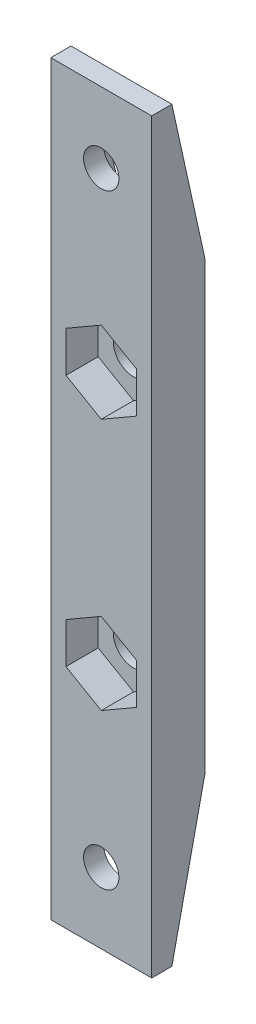
ISO-10303-21;
HEADER;
FILE_DESCRIPTION(('STEP AP214'),'2;1');
FILE_NAME('part.step','',(''),(''),'','','');
FILE_SCHEMA(('AUTOMOTIVE_DESIGN { 1 0 10303 214 1 1 1 1 }'));
ENDSEC;
DATA;
#1=APPLICATION_CONTEXT('core data for automotive mechanical design processes');
#2=APPLICATION_PROTOCOL_DEFINITION('international standard','automotive_design',2000,#1);
#3=PRODUCT_CONTEXT('',#1,'mechanical');
#4=PRODUCT('Part','Part','',(#3));
#5=PRODUCT_RELATED_PRODUCT_CATEGORY('part','',(#4));
#6=PRODUCT_DEFINITION_FORMATION('','',#4);
#7=PRODUCT_DEFINITION_CONTEXT('part definition',#1,'design');
#8=PRODUCT_DEFINITION('design','',#6,#7);
#9=PRODUCT_DEFINITION_SHAPE('','',#8);
#10=(LENGTH_UNIT() NAMED_UNIT(*) SI_UNIT(.MILLI.,.METRE.));
#11=(NAMED_UNIT(*) PLANE_ANGLE_UNIT() SI_UNIT($,.RADIAN.));
#12=(NAMED_UNIT(*) SI_UNIT($,.STERADIAN.) SOLID_ANGLE_UNIT());
#13=UNCERTAINTY_MEASURE_WITH_UNIT(LENGTH_MEASURE(1.E-05),#10,'distance_accuracy_value','');
#14=(GEOMETRIC_REPRESENTATION_CONTEXT(3) GLOBAL_UNCERTAINTY_ASSIGNED_CONTEXT((#13)) GLOBAL_UNIT_ASSIGNED_CONTEXT((#10,
#11,#12)) REPRESENTATION_CONTEXT('',''));
#15=CARTESIAN_POINT('',(0.,0.,0.));
#16=DIRECTION('',(0.,0.,1.));
#17=DIRECTION('',(1.,0.,0.));
#18=AXIS2_PLACEMENT_3D('',#15,#16,#17);
#19=CARTESIAN_POINT('',(0.,0.,5.3));
#20=DIRECTION('',(1.,0.,0.));
#21=DIRECTION('',(0.,1.,0.));
#22=AXIS2_PLACEMENT_3D('',#19,#20,#21);
#23=PLANE('',#22);
#24=DIRECTION('',(0.,-1.,0.));
#25=VECTOR('',#24,1.);
#26=CARTESIAN_POINT('',(0.,0.,0.));
#27=LINE('',#26,#25);
#28=CARTESIAN_POINT('',(0.,47.,0.));
#29=VERTEX_POINT('',#28);
#30=CARTESIAN_POINT('',(0.,3.,0.));
#31=VERTEX_POINT('',#30);
#32=EDGE_CURVE('E366',#29,#31,#27,.T.);
#33=ORIENTED_EDGE('',*,*,#32,.T.);
#34=DIRECTION('',(0.,0.97664446670509,-0.21486178267512));
#35=VECTOR('',#34,1.);
#36=CARTESIAN_POINT('',(0.,-12.,3.3));
#37=LINE('',#36,#35);
#38=CARTESIAN_POINT('',(0.,-12.,3.3));
#39=VERTEX_POINT('',#38);
#40=EDGE_CURVE('E234',#39,#31,#37,.T.);
#41=ORIENTED_EDGE('',*,*,#40,.F.);
#42=DIRECTION('',(0.,0.,-1.));
#43=VECTOR('',#42,1.);
#44=CARTESIAN_POINT('',(0.,-12.,5.3));
#45=LINE('',#44,#43);
#46=CARTESIAN_POINT('',(0.,-12.,5.3));
#47=VERTEX_POINT('',#46);
#48=EDGE_CURVE('E252',#47,#39,#45,.T.);
#49=ORIENTED_EDGE('',*,*,#48,.F.);
#50=DIRECTION('',(0.,-1.,0.));
#51=VECTOR('',#50,1.);
#52=CARTESIAN_POINT('',(0.,0.,5.3));
#53=LINE('',#52,#51);
#54=CARTESIAN_POINT('',(0.,62.,5.3));
#55=VERTEX_POINT('',#54);
#56=EDGE_CURVE('E377',#55,#47,#53,.T.);
#57=ORIENTED_EDGE('',*,*,#56,.F.);
#58=DIRECTION('',(0.,0.,1.));
#59=VECTOR('',#58,1.);
#60=CARTESIAN_POINT('',(0.,62.,0.));
#61=LINE('',#60,#59);
#62=CARTESIAN_POINT('',(0.,62.,3.30000000000003));
#63=VERTEX_POINT('',#62);
#64=EDGE_CURVE('E263',#63,#55,#61,.T.);
#65=ORIENTED_EDGE('',*,*,#64,.F.);
#66=DIRECTION('',(0.,0.97664446670509,0.214861782675121));
#67=VECTOR('',#66,1.);
#68=CARTESIAN_POINT('',(0.,62.,3.30000000000003));
#69=LINE('',#68,#67);
#70=EDGE_CURVE('E244',#29,#63,#69,.T.);
#71=ORIENTED_EDGE('',*,*,#70,.F.);
#72=EDGE_LOOP('',(#33,#41,#49,#57,#65,#71));
#73=FACE_BOUND('',#72,.T.);
#74=ADVANCED_FACE('F33',(#73),#23,.F.);
#75=CARTESIAN_POINT('',(10.,0.,5.3));
#76=DIRECTION('',(-1.,0.,0.));
#77=DIRECTION('',(0.,-1.,0.));
#78=AXIS2_PLACEMENT_3D('',#75,#76,#77);
#79=PLANE('',#78);
#80=DIRECTION('',(0.,0.,1.));
#81=VECTOR('',#80,1.);
#82=CARTESIAN_POINT('',(10.,-12.,5.3));
#83=LINE('',#82,#81);
#84=CARTESIAN_POINT('',(10.,-12.,3.3));
#85=VERTEX_POINT('',#84);
#86=CARTESIAN_POINT('',(10.,-12.,5.3));
#87=VERTEX_POINT('',#86);
#88=EDGE_CURVE('E255',#85,#87,#83,.T.);
#89=ORIENTED_EDGE('',*,*,#88,.F.);
#90=DIRECTION('',(0.,0.97664446670509,-0.21486178267512));
#91=VECTOR('',#90,1.);
#92=CARTESIAN_POINT('',(10.,-0.97367417016406,0.874208317436093));
#93=LINE('',#92,#91);
#94=CARTESIAN_POINT('',(10.,3.,0.));
#95=VERTEX_POINT('',#94);
#96=EDGE_CURVE('E241',#85,#95,#93,.T.);
#97=ORIENTED_EDGE('',*,*,#96,.T.);
#98=DIRECTION('',(0.,1.,0.));
#99=VECTOR('',#98,1.);
#100=CARTESIAN_POINT('',(10.,0.,0.));
#101=LINE('',#100,#99);
#102=CARTESIAN_POINT('',(10.,47.,0.));
#103=VERTEX_POINT('',#102);
#104=EDGE_CURVE('E380',#95,#103,#101,.T.);
#105=ORIENTED_EDGE('',*,*,#104,.T.);
#106=DIRECTION('',(0.,0.97664446670509,0.214861782675121));
#107=VECTOR('',#106,1.);
#108=CARTESIAN_POINT('',(10.,3.28195345288062,-9.61797024036634));
#109=LINE('',#108,#107);
#110=CARTESIAN_POINT('',(9.99999999999999,62.,3.30000000000003));
#111=VERTEX_POINT('',#110);
#112=EDGE_CURVE('E249',#103,#111,#109,.T.);
#113=ORIENTED_EDGE('',*,*,#112,.T.);
#114=DIRECTION('',(0.,0.,-1.));
#115=VECTOR('',#114,1.);
#116=CARTESIAN_POINT('',(9.99999999999999,62.,0.));
#117=LINE('',#116,#115);
#118=CARTESIAN_POINT('',(9.99999999999999,62.,5.3));
#119=VERTEX_POINT('',#118);
#120=EDGE_CURVE('E260',#119,#111,#117,.T.);
#121=ORIENTED_EDGE('',*,*,#120,.F.);
#122=DIRECTION('',(0.,1.,0.));
#123=VECTOR('',#122,1.);
#124=CARTESIAN_POINT('',(10.,0.,5.3));
#125=LINE('',#124,#123);
#126=EDGE_CURVE('E379',#87,#119,#125,.T.);
#127=ORIENTED_EDGE('',*,*,#126,.F.);
#128=EDGE_LOOP('',(#89,#97,#105,#113,#121,#127));
#129=FACE_BOUND('',#128,.T.);
#130=ADVANCED_FACE('F426',(#129),#79,.F.);
#131=CARTESIAN_POINT('',(0.,0.,5.3));
#132=DIRECTION('',(0.,0.,-1.));
#133=DIRECTION('',(-1.,0.,0.));
#134=AXIS2_PLACEMENT_3D('',#131,#132,#133);
#135=PLANE('',#134);
#136=CARTESIAN_POINT('',(4.99999999999999,55.,5.3));
#137=DIRECTION('',(0.,0.,-1.));
#138=DIRECTION('',(-1.,0.,0.));
#139=AXIS2_PLACEMENT_3D('',#136,#137,#138);
#140=CIRCLE('',#139,1.75);
#141=CARTESIAN_POINT('',(3.24999999999999,55.,5.3));
#142=VERTEX_POINT('',#141);
#143=EDGE_CURVE('E626',#142,#142,#140,.T.);
#144=ORIENTED_EDGE('',*,*,#143,.T.);
#145=EDGE_LOOP('',(#144));
#146=FACE_BOUND('',#145,.T.);
#147=CARTESIAN_POINT('',(5.,-5.,5.3));
#148=DIRECTION('',(0.,0.,-1.));
#149=DIRECTION('',(-1.,0.,0.));
#150=AXIS2_PLACEMENT_3D('',#147,#148,#149);
#151=CIRCLE('',#150,1.75);
#152=CARTESIAN_POINT('',(3.25,-5.,5.3));
#153=VERTEX_POINT('',#152);
#154=EDGE_CURVE('E212',#153,#153,#151,.T.);
#155=ORIENTED_EDGE('',*,*,#154,.T.);
#156=EDGE_LOOP('',(#155));
#157=FACE_BOUND('',#156,.T.);
#158=DIRECTION('',(-0.866025403784438,0.500000000000001,0.));
#159=VECTOR('',#158,1.);
#160=CARTESIAN_POINT('',(8.5,14.5207259421638,5.3));
#161=LINE('',#160,#159);
#162=CARTESIAN_POINT('',(8.5,14.5207259421638,5.3));
#163=VERTEX_POINT('',#162);
#164=CARTESIAN_POINT('',(5.,16.5414518843275,5.3));
#165=VERTEX_POINT('',#164);
#166=EDGE_CURVE('E302',#163,#165,#161,.T.);
#167=ORIENTED_EDGE('',*,*,#166,.F.);
#168=DIRECTION('',(0.,1.,0.));
#169=VECTOR('',#168,1.);
#170=CARTESIAN_POINT('',(8.5,10.4792740578363,5.3));
#171=LINE('',#170,#169);
#172=CARTESIAN_POINT('',(8.5,10.4792740578363,5.3));
#173=VERTEX_POINT('',#172);
#174=EDGE_CURVE('E280',#173,#163,#171,.T.);
#175=ORIENTED_EDGE('',*,*,#174,.F.);
#176=DIRECTION('',(0.866025403784439,0.5,0.));
#177=VECTOR('',#176,1.);
#178=CARTESIAN_POINT('',(5.,8.45854811567262,5.3));
#179=LINE('',#178,#177);
#180=CARTESIAN_POINT('',(5.,8.45854811567262,5.3));
#181=VERTEX_POINT('',#180);
#182=EDGE_CURVE('E285',#181,#173,#179,.T.);
#183=ORIENTED_EDGE('',*,*,#182,.F.);
#184=DIRECTION('',(0.866025403784439,-0.5,0.));
#185=VECTOR('',#184,1.);
#186=CARTESIAN_POINT('',(1.49999999999992,10.4792740578364,5.3));
#187=LINE('',#186,#185);
#188=CARTESIAN_POINT('',(1.49999999999992,10.4792740578364,5.3));
#189=VERTEX_POINT('',#188);
#190=EDGE_CURVE('E311',#189,#181,#187,.T.);
#191=ORIENTED_EDGE('',*,*,#190,.F.);
#192=DIRECTION('',(0.,-1.,0.));
#193=VECTOR('',#192,1.);
#194=CARTESIAN_POINT('',(1.49999999999992,14.5207259421637,5.3));
#195=LINE('',#194,#193);
#196=CARTESIAN_POINT('',(1.49999999999992,14.5207259421637,5.3));
#197=VERTEX_POINT('',#196);
#198=EDGE_CURVE('E308',#197,#189,#195,.T.);
#199=ORIENTED_EDGE('',*,*,#198,.F.);
#200=DIRECTION('',(-0.866025403784439,-0.5,0.));
#201=VECTOR('',#200,1.);
#202=CARTESIAN_POINT('',(5.,16.5414518843275,5.3));
#203=LINE('',#202,#201);
#204=EDGE_CURVE('E305',#165,#197,#203,.T.);
#205=ORIENTED_EDGE('',*,*,#204,.F.);
#206=EDGE_LOOP('',(#167,#175,#183,#191,#199,#205));
#207=FACE_BOUND('',#206,.T.);
#208=DIRECTION('',(-0.866025403784437,0.500000000000003,0.));
#209=VECTOR('',#208,1.);
#210=CARTESIAN_POINT('',(8.5,39.5207259421637,5.3));
#211=LINE('',#210,#209);
#212=CARTESIAN_POINT('',(8.5,39.5207259421637,5.3));
#213=VERTEX_POINT('',#212);
#214=CARTESIAN_POINT('',(5.,41.5414518843274,5.3));
#215=VERTEX_POINT('',#214);
#216=EDGE_CURVE('E350',#213,#215,#211,.T.);
#217=ORIENTED_EDGE('',*,*,#216,.F.);
#218=DIRECTION('',(0.,1.,0.));
#219=VECTOR('',#218,1.);
#220=CARTESIAN_POINT('',(8.49999999999999,35.4792740578363,5.3));
#221=LINE('',#220,#219);
#222=CARTESIAN_POINT('',(8.49999999999999,35.4792740578363,5.3));
#223=VERTEX_POINT('',#222);
#224=EDGE_CURVE('E318',#223,#213,#221,.T.);
#225=ORIENTED_EDGE('',*,*,#224,.F.);
#226=DIRECTION('',(0.866025403784441,0.499999999999997,0.));
#227=VECTOR('',#226,1.);
#228=CARTESIAN_POINT('',(4.99999999999999,33.4585481156726,5.3));
#229=LINE('',#228,#227);
#230=CARTESIAN_POINT('',(4.99999999999999,33.4585481156726,5.3));
#231=VERTEX_POINT('',#230);
#232=EDGE_CURVE('E333',#231,#223,#229,.T.);
#233=ORIENTED_EDGE('',*,*,#232,.F.);
#234=DIRECTION('',(0.86602540378444,-0.499999999999998,0.));
#235=VECTOR('',#234,1.);
#236=CARTESIAN_POINT('',(1.49999999999999,35.4792740578363,5.3));
#237=LINE('',#236,#235);
#238=CARTESIAN_POINT('',(1.49999999999999,35.4792740578363,5.3));
#239=VERTEX_POINT('',#238);
#240=EDGE_CURVE('E359',#239,#231,#237,.T.);
#241=ORIENTED_EDGE('',*,*,#240,.F.);
#242=DIRECTION('',(0.,-1.,0.));
#243=VECTOR('',#242,1.);
#244=CARTESIAN_POINT('',(1.5,39.5207259421637,5.3));
#245=LINE('',#244,#243);
#246=CARTESIAN_POINT('',(1.5,39.5207259421637,5.3));
#247=VERTEX_POINT('',#246);
#248=EDGE_CURVE('E356',#247,#239,#245,.T.);
#249=ORIENTED_EDGE('',*,*,#248,.F.);
#250=DIRECTION('',(-0.866025403784441,-0.499999999999997,0.));
#251=VECTOR('',#250,1.);
#252=CARTESIAN_POINT('',(5.,41.5414518843274,5.3));
#253=LINE('',#252,#251);
#254=EDGE_CURVE('E353',#215,#247,#253,.T.);
#255=ORIENTED_EDGE('',*,*,#254,.F.);
#256=EDGE_LOOP('',(#217,#225,#233,#241,#249,#255));
#257=FACE_BOUND('',#256,.T.);
#258=ORIENTED_EDGE('',*,*,#56,.T.);
#259=DIRECTION('',(-1.,0.,0.));
#260=VECTOR('',#259,1.);
#261=CARTESIAN_POINT('',(0.,-12.,5.3));
#262=LINE('',#261,#260);
#263=EDGE_CURVE('E257',#87,#47,#262,.T.);
#264=ORIENTED_EDGE('',*,*,#263,.F.);
#265=ORIENTED_EDGE('',*,*,#126,.T.);
#266=DIRECTION('',(1.,0.,0.));
#267=VECTOR('',#266,1.);
#268=CARTESIAN_POINT('',(9.99999999999999,62.,5.3));
#269=LINE('',#268,#267);
#270=EDGE_CURVE('E265',#55,#119,#269,.T.);
#271=ORIENTED_EDGE('',*,*,#270,.F.);
#272=EDGE_LOOP('',(#258,#264,#265,#271));
#273=FACE_BOUND('',#272,.T.);
#274=ADVANCED_FACE('F432',(#146,#157,#207,#257,#273),#135,.F.);
#275=CARTESIAN_POINT('',(0.,0.,0.));
#276=DIRECTION('',(0.,0.,-1.));
#277=DIRECTION('',(-1.,0.,0.));
#278=AXIS2_PLACEMENT_3D('',#275,#276,#277);
#279=PLANE('',#278);
#280=DIRECTION('',(-1.,0.,0.));
#281=VECTOR('',#280,1.);
#282=CARTESIAN_POINT('',(12.,3.,0.));
#283=LINE('',#282,#281);
#284=EDGE_CURVE('E238',#95,#31,#283,.T.);
#285=ORIENTED_EDGE('',*,*,#284,.T.);
#286=ORIENTED_EDGE('',*,*,#32,.F.);
#287=DIRECTION('',(-1.,0.,0.));
#288=VECTOR('',#287,1.);
#289=CARTESIAN_POINT('',(12.,47.,0.));
#290=LINE('',#289,#288);
#291=EDGE_CURVE('E247',#103,#29,#290,.T.);
#292=ORIENTED_EDGE('',*,*,#291,.F.);
#293=ORIENTED_EDGE('',*,*,#104,.F.);
#294=EDGE_LOOP('',(#285,#286,#292,#293));
#295=FACE_BOUND('',#294,.T.);
#296=CARTESIAN_POINT('',(5.,12.5,0.));
#297=DIRECTION('',(0.,0.,-1.));
#298=DIRECTION('',(-1.,0.,0.));
#299=AXIS2_PLACEMENT_3D('',#296,#297,#298);
#300=CIRCLE('',#299,2.);
#301=CARTESIAN_POINT('',(3.,12.5,0.));
#302=VERTEX_POINT('',#301);
#303=EDGE_CURVE('E271',#302,#302,#300,.T.);
#304=ORIENTED_EDGE('',*,*,#303,.F.);
#305=EDGE_LOOP('',(#304));
#306=FACE_BOUND('',#305,.T.);
#307=CARTESIAN_POINT('',(5.,37.5,0.));
#308=DIRECTION('',(0.,0.,-1.));
#309=DIRECTION('',(-1.,0.,0.));
#310=AXIS2_PLACEMENT_3D('',#307,#308,#309);
#311=CIRCLE('',#310,2.);
#312=CARTESIAN_POINT('',(3.,37.5,0.));
#313=VERTEX_POINT('',#312);
#314=EDGE_CURVE('E277',#313,#313,#311,.T.);
#315=ORIENTED_EDGE('',*,*,#314,.F.);
#316=EDGE_LOOP('',(#315));
#317=FACE_BOUND('',#316,.T.);
#318=ADVANCED_FACE('F422',(#295,#306,#317),#279,.T.);
#319=CARTESIAN_POINT('',(8.49999999999999,35.4792740578363,2.1));
#320=DIRECTION('',(1.,0.,0.));
#321=DIRECTION('',(0.,1.,0.));
#322=AXIS2_PLACEMENT_3D('',#319,#320,#321);
#323=PLANE('',#322);
#324=ORIENTED_EDGE('',*,*,#224,.T.);
#325=DIRECTION('',(0.,0.,1.));
#326=VECTOR('',#325,1.);
#327=CARTESIAN_POINT('',(8.5,39.5207259421637,2.1));
#328=LINE('',#327,#326);
#329=CARTESIAN_POINT('',(8.5,39.5207259421637,2.1));
#330=VERTEX_POINT('',#329);
#331=EDGE_CURVE('E348',#330,#213,#328,.T.);
#332=ORIENTED_EDGE('',*,*,#331,.F.);
#333=DIRECTION('',(0.,1.,0.));
#334=VECTOR('',#333,1.);
#335=CARTESIAN_POINT('',(8.49999999999999,35.4792740578363,2.1));
#336=LINE('',#335,#334);
#337=CARTESIAN_POINT('',(8.49999999999999,35.4792740578363,2.1));
#338=VERTEX_POINT('',#337);
#339=EDGE_CURVE('E329',#338,#330,#336,.T.);
#340=ORIENTED_EDGE('',*,*,#339,.F.);
#341=DIRECTION('',(0.,0.,1.));
#342=VECTOR('',#341,1.);
#343=CARTESIAN_POINT('',(8.49999999999999,35.4792740578363,2.1));
#344=LINE('',#343,#342);
#345=EDGE_CURVE('E364',#338,#223,#344,.T.);
#346=ORIENTED_EDGE('',*,*,#345,.T.);
#347=EDGE_LOOP('',(#324,#332,#340,#346));
#348=FACE_BOUND('',#347,.T.);
#349=ADVANCED_FACE('F469',(#348),#323,.F.);
#350=CARTESIAN_POINT('',(4.99999999999999,33.4585481156726,2.1));
#351=DIRECTION('',(0.499999999999997,-0.866025403784441,0.));
#352=DIRECTION('',(0.866025403784441,0.499999999999997,0.));
#353=AXIS2_PLACEMENT_3D('',#350,#351,#352);
#354=PLANE('',#353);
#355=ORIENTED_EDGE('',*,*,#232,.T.);
#356=ORIENTED_EDGE('',*,*,#345,.F.);
#357=DIRECTION('',(0.866025403784441,0.499999999999997,0.));
#358=VECTOR('',#357,1.);
#359=CARTESIAN_POINT('',(4.99999999999999,33.4585481156726,2.1));
#360=LINE('',#359,#358);
#361=CARTESIAN_POINT('',(4.99999999999999,33.4585481156726,2.1));
#362=VERTEX_POINT('',#361);
#363=EDGE_CURVE('E345',#362,#338,#360,.T.);
#364=ORIENTED_EDGE('',*,*,#363,.F.);
#365=DIRECTION('',(0.,0.,1.));
#366=VECTOR('',#365,1.);
#367=CARTESIAN_POINT('',(4.99999999999999,33.4585481156726,2.1));
#368=LINE('',#367,#366);
#369=EDGE_CURVE('E367',#362,#231,#368,.T.);
#370=ORIENTED_EDGE('',*,*,#369,.T.);
#371=EDGE_LOOP('',(#355,#356,#364,#370));
#372=FACE_BOUND('',#371,.T.);
#373=ADVANCED_FACE('F473',(#372),#354,.F.);
#374=CARTESIAN_POINT('',(1.49999999999999,35.4792740578363,2.1));
#375=DIRECTION('',(-0.499999999999998,-0.86602540378444,0.));
#376=DIRECTION('',(0.86602540378444,-0.499999999999998,0.));
#377=AXIS2_PLACEMENT_3D('',#374,#375,#376);
#378=PLANE('',#377);
#379=ORIENTED_EDGE('',*,*,#240,.T.);
#380=ORIENTED_EDGE('',*,*,#369,.F.);
#381=DIRECTION('',(0.86602540378444,-0.499999999999998,0.));
#382=VECTOR('',#381,1.);
#383=CARTESIAN_POINT('',(1.49999999999999,35.4792740578363,2.1));
#384=LINE('',#383,#382);
#385=CARTESIAN_POINT('',(1.49999999999999,35.4792740578363,2.1));
#386=VERTEX_POINT('',#385);
#387=EDGE_CURVE('E342',#386,#362,#384,.T.);
#388=ORIENTED_EDGE('',*,*,#387,.F.);
#389=DIRECTION('',(0.,0.,1.));
#390=VECTOR('',#389,1.);
#391=CARTESIAN_POINT('',(1.49999999999999,35.4792740578363,2.1));
#392=LINE('',#391,#390);
#393=EDGE_CURVE('E369',#386,#239,#392,.T.);
#394=ORIENTED_EDGE('',*,*,#393,.T.);
#395=EDGE_LOOP('',(#379,#380,#388,#394));
#396=FACE_BOUND('',#395,.T.);
#397=ADVANCED_FACE('F487',(#396),#378,.F.);
#398=CARTESIAN_POINT('',(1.5,39.5207259421637,2.1));
#399=DIRECTION('',(-1.,0.,0.));
#400=DIRECTION('',(0.,-1.,0.));
#401=AXIS2_PLACEMENT_3D('',#398,#399,#400);
#402=PLANE('',#401);
#403=ORIENTED_EDGE('',*,*,#248,.T.);
#404=ORIENTED_EDGE('',*,*,#393,.F.);
#405=DIRECTION('',(0.,-1.,0.));
#406=VECTOR('',#405,1.);
#407=CARTESIAN_POINT('',(1.5,39.5207259421637,2.1));
#408=LINE('',#407,#406);
#409=CARTESIAN_POINT('',(1.5,39.5207259421637,2.1));
#410=VERTEX_POINT('',#409);
#411=EDGE_CURVE('E339',#410,#386,#408,.T.);
#412=ORIENTED_EDGE('',*,*,#411,.F.);
#413=DIRECTION('',(0.,0.,1.));
#414=VECTOR('',#413,1.);
#415=CARTESIAN_POINT('',(1.5,39.5207259421637,2.1));
#416=LINE('',#415,#414);
#417=EDGE_CURVE('E371',#410,#247,#416,.T.);
#418=ORIENTED_EDGE('',*,*,#417,.T.);
#419=EDGE_LOOP('',(#403,#404,#412,#418));
#420=FACE_BOUND('',#419,.T.);
#421=ADVANCED_FACE('F483',(#420),#402,.F.);
#422=CARTESIAN_POINT('',(5.,41.5414518843274,2.1));
#423=DIRECTION('',(-0.499999999999997,0.86602540378444,0.));
#424=DIRECTION('',(-0.866025403784441,-0.499999999999997,0.));
#425=AXIS2_PLACEMENT_3D('',#422,#423,#424);
#426=PLANE('',#425);
#427=ORIENTED_EDGE('',*,*,#254,.T.);
#428=ORIENTED_EDGE('',*,*,#417,.F.);
#429=DIRECTION('',(-0.866025403784441,-0.499999999999997,0.));
#430=VECTOR('',#429,1.);
#431=CARTESIAN_POINT('',(5.,41.5414518843274,2.1));
#432=LINE('',#431,#430);
#433=CARTESIAN_POINT('',(5.,41.5414518843274,2.1));
#434=VERTEX_POINT('',#433);
#435=EDGE_CURVE('E336',#434,#410,#432,.T.);
#436=ORIENTED_EDGE('',*,*,#435,.F.);
#437=DIRECTION('',(0.,0.,1.));
#438=VECTOR('',#437,1.);
#439=CARTESIAN_POINT('',(5.,41.5414518843274,2.1));
#440=LINE('',#439,#438);
#441=EDGE_CURVE('E373',#434,#215,#440,.T.);
#442=ORIENTED_EDGE('',*,*,#441,.T.);
#443=EDGE_LOOP('',(#427,#428,#436,#442));
#444=FACE_BOUND('',#443,.T.);
#445=ADVANCED_FACE('F479',(#444),#426,.F.);
#446=CARTESIAN_POINT('',(8.5,39.5207259421637,2.1));
#447=DIRECTION('',(0.500000000000003,0.866025403784437,0.));
#448=DIRECTION('',(-0.866025403784437,0.500000000000003,0.));
#449=AXIS2_PLACEMENT_3D('',#446,#447,#448);
#450=PLANE('',#449);
#451=ORIENTED_EDGE('',*,*,#216,.T.);
#452=ORIENTED_EDGE('',*,*,#441,.F.);
#453=DIRECTION('',(-0.866025403784437,0.500000000000003,0.));
#454=VECTOR('',#453,1.);
#455=CARTESIAN_POINT('',(8.5,39.5207259421637,2.1));
#456=LINE('',#455,#454);
#457=EDGE_CURVE('E332',#330,#434,#456,.T.);
#458=ORIENTED_EDGE('',*,*,#457,.F.);
#459=ORIENTED_EDGE('',*,*,#331,.T.);
#460=EDGE_LOOP('',(#451,#452,#458,#459));
#461=FACE_BOUND('',#460,.T.);
#462=ADVANCED_FACE('F475',(#461),#450,.F.);
#463=CARTESIAN_POINT('',(0.,0.,2.1));
#464=DIRECTION('',(0.,0.,1.));
#465=DIRECTION('',(1.,0.,0.));
#466=AXIS2_PLACEMENT_3D('',#463,#464,#465);
#467=PLANE('',#466);
#468=CARTESIAN_POINT('',(5.,37.5,2.1));
#469=DIRECTION('',(0.,0.,1.));
#470=DIRECTION('',(1.,0.,0.));
#471=AXIS2_PLACEMENT_3D('',#468,#469,#470);
#472=CIRCLE('',#471,2.);
#473=CARTESIAN_POINT('',(7.,37.5,2.1));
#474=VERTEX_POINT('',#473);
#475=EDGE_CURVE('E274',#474,#474,#472,.T.);
#476=ORIENTED_EDGE('',*,*,#475,.F.);
#477=EDGE_LOOP('',(#476));
#478=FACE_BOUND('',#477,.T.);
#479=ORIENTED_EDGE('',*,*,#339,.T.);
#480=ORIENTED_EDGE('',*,*,#457,.T.);
#481=ORIENTED_EDGE('',*,*,#435,.T.);
#482=ORIENTED_EDGE('',*,*,#411,.T.);
#483=ORIENTED_EDGE('',*,*,#387,.T.);
#484=ORIENTED_EDGE('',*,*,#363,.T.);
#485=EDGE_LOOP('',(#479,#480,#481,#482,#483,#484));
#486=FACE_BOUND('',#485,.T.);
#487=ADVANCED_FACE('F478',(#478,#486),#467,.T.);
#488=CARTESIAN_POINT('',(8.5,10.4792740578363,2.1));
#489=DIRECTION('',(1.,0.,0.));
#490=DIRECTION('',(0.,0.,-1.));
#491=AXIS2_PLACEMENT_3D('',#488,#489,#490);
#492=PLANE('',#491);
#493=ORIENTED_EDGE('',*,*,#174,.T.);
#494=DIRECTION('',(0.,0.,1.));
#495=VECTOR('',#494,1.);
#496=CARTESIAN_POINT('',(8.5,14.5207259421638,2.1));
#497=LINE('',#496,#495);
#498=CARTESIAN_POINT('',(8.5,14.5207259421638,2.1));
#499=VERTEX_POINT('',#498);
#500=EDGE_CURVE('E300',#499,#163,#497,.T.);
#501=ORIENTED_EDGE('',*,*,#500,.F.);
#502=DIRECTION('',(0.,1.,0.));
#503=VECTOR('',#502,1.);
#504=CARTESIAN_POINT('',(8.5,10.4792740578363,2.1));
#505=LINE('',#504,#503);
#506=CARTESIAN_POINT('',(8.5,10.4792740578363,2.1));
#507=VERTEX_POINT('',#506);
#508=EDGE_CURVE('E281',#507,#499,#505,.T.);
#509=ORIENTED_EDGE('',*,*,#508,.F.);
#510=DIRECTION('',(0.,0.,1.));
#511=VECTOR('',#510,1.);
#512=CARTESIAN_POINT('',(8.5,10.4792740578363,2.1));
#513=LINE('',#512,#511);
#514=EDGE_CURVE('E316',#507,#173,#513,.T.);
#515=ORIENTED_EDGE('',*,*,#514,.T.);
#516=EDGE_LOOP('',(#493,#501,#509,#515));
#517=FACE_BOUND('',#516,.T.);
#518=ADVANCED_FACE('F497',(#517),#492,.F.);
#519=CARTESIAN_POINT('',(5.,8.45854811567262,2.1));
#520=DIRECTION('',(0.5,-0.866025403784438,0.));
#521=DIRECTION('',(0.866025403784439,0.5,0.));
#522=AXIS2_PLACEMENT_3D('',#519,#520,#521);
#523=PLANE('',#522);
#524=ORIENTED_EDGE('',*,*,#182,.T.);
#525=ORIENTED_EDGE('',*,*,#514,.F.);
#526=DIRECTION('',(0.866025403784439,0.5,0.));
#527=VECTOR('',#526,1.);
#528=CARTESIAN_POINT('',(5.,8.45854811567262,2.1));
#529=LINE('',#528,#527);
#530=CARTESIAN_POINT('',(5.,8.45854811567262,2.1));
#531=VERTEX_POINT('',#530);
#532=EDGE_CURVE('E297',#531,#507,#529,.T.);
#533=ORIENTED_EDGE('',*,*,#532,.F.);
#534=DIRECTION('',(0.,0.,1.));
#535=VECTOR('',#534,1.);
#536=CARTESIAN_POINT('',(5.,8.45854811567262,2.1));
#537=LINE('',#536,#535);
#538=EDGE_CURVE('E319',#531,#181,#537,.T.);
#539=ORIENTED_EDGE('',*,*,#538,.T.);
#540=EDGE_LOOP('',(#524,#525,#533,#539));
#541=FACE_BOUND('',#540,.T.);
#542=ADVANCED_FACE('F501',(#541),#523,.F.);
#543=CARTESIAN_POINT('',(1.49999999999992,10.4792740578364,2.1));
#544=DIRECTION('',(-0.5,-0.866025403784439,0.));
#545=DIRECTION('',(0.866025403784439,-0.5,0.));
#546=AXIS2_PLACEMENT_3D('',#543,#544,#545);
#547=PLANE('',#546);
#548=ORIENTED_EDGE('',*,*,#190,.T.);
#549=ORIENTED_EDGE('',*,*,#538,.F.);
#550=DIRECTION('',(0.866025403784439,-0.5,0.));
#551=VECTOR('',#550,1.);
#552=CARTESIAN_POINT('',(1.49999999999992,10.4792740578364,2.1));
#553=LINE('',#552,#551);
#554=CARTESIAN_POINT('',(1.49999999999992,10.4792740578364,2.1));
#555=VERTEX_POINT('',#554);
#556=EDGE_CURVE('E294',#555,#531,#553,.T.);
#557=ORIENTED_EDGE('',*,*,#556,.F.);
#558=DIRECTION('',(0.,0.,1.));
#559=VECTOR('',#558,1.);
#560=CARTESIAN_POINT('',(1.49999999999992,10.4792740578364,2.1));
#561=LINE('',#560,#559);
#562=EDGE_CURVE('E321',#555,#189,#561,.T.);
#563=ORIENTED_EDGE('',*,*,#562,.T.);
#564=EDGE_LOOP('',(#548,#549,#557,#563));
#565=FACE_BOUND('',#564,.T.);
#566=ADVANCED_FACE('F515',(#565),#547,.F.);
#567=CARTESIAN_POINT('',(1.49999999999992,14.5207259421637,2.1));
#568=DIRECTION('',(-1.,0.,0.));
#569=DIRECTION('',(0.,-1.,0.));
#570=AXIS2_PLACEMENT_3D('',#567,#568,#569);
#571=PLANE('',#570);
#572=ORIENTED_EDGE('',*,*,#198,.T.);
#573=ORIENTED_EDGE('',*,*,#562,.F.);
#574=DIRECTION('',(0.,-1.,0.));
#575=VECTOR('',#574,1.);
#576=CARTESIAN_POINT('',(1.49999999999992,14.5207259421637,2.1));
#577=LINE('',#576,#575);
#578=CARTESIAN_POINT('',(1.49999999999992,14.5207259421637,2.1));
#579=VERTEX_POINT('',#578);
#580=EDGE_CURVE('E291',#579,#555,#577,.T.);
#581=ORIENTED_EDGE('',*,*,#580,.F.);
#582=DIRECTION('',(0.,0.,1.));
#583=VECTOR('',#582,1.);
#584=CARTESIAN_POINT('',(1.49999999999992,14.5207259421637,2.1));
#585=LINE('',#584,#583);
#586=EDGE_CURVE('E323',#579,#197,#585,.T.);
#587=ORIENTED_EDGE('',*,*,#586,.T.);
#588=EDGE_LOOP('',(#572,#573,#581,#587));
#589=FACE_BOUND('',#588,.T.);
#590=ADVANCED_FACE('F511',(#589),#571,.F.);
#591=CARTESIAN_POINT('',(5.,16.5414518843275,2.1));
#592=DIRECTION('',(-0.5,0.866025403784439,0.));
#593=DIRECTION('',(-0.866025403784439,-0.5,0.));
#594=AXIS2_PLACEMENT_3D('',#591,#592,#593);
#595=PLANE('',#594);
#596=ORIENTED_EDGE('',*,*,#204,.T.);
#597=ORIENTED_EDGE('',*,*,#586,.F.);
#598=DIRECTION('',(-0.866025403784439,-0.5,0.));
#599=VECTOR('',#598,1.);
#600=CARTESIAN_POINT('',(5.,16.5414518843275,2.1));
#601=LINE('',#600,#599);
#602=CARTESIAN_POINT('',(5.,16.5414518843275,2.1));
#603=VERTEX_POINT('',#602);
#604=EDGE_CURVE('E288',#603,#579,#601,.T.);
#605=ORIENTED_EDGE('',*,*,#604,.F.);
#606=DIRECTION('',(0.,0.,1.));
#607=VECTOR('',#606,1.);
#608=CARTESIAN_POINT('',(5.,16.5414518843275,2.1));
#609=LINE('',#608,#607);
#610=EDGE_CURVE('E325',#603,#165,#609,.T.);
#611=ORIENTED_EDGE('',*,*,#610,.T.);
#612=EDGE_LOOP('',(#596,#597,#605,#611));
#613=FACE_BOUND('',#612,.T.);
#614=ADVANCED_FACE('F507',(#613),#595,.F.);
#615=CARTESIAN_POINT('',(8.5,14.5207259421638,2.1));
#616=DIRECTION('',(0.500000000000001,0.866025403784438,0.));
#617=DIRECTION('',(-0.866025403784438,0.500000000000001,0.));
#618=AXIS2_PLACEMENT_3D('',#615,#616,#617);
#619=PLANE('',#618);
#620=ORIENTED_EDGE('',*,*,#166,.T.);
#621=ORIENTED_EDGE('',*,*,#610,.F.);
#622=DIRECTION('',(-0.866025403784438,0.500000000000001,0.));
#623=VECTOR('',#622,1.);
#624=CARTESIAN_POINT('',(8.5,14.5207259421638,2.1));
#625=LINE('',#624,#623);
#626=EDGE_CURVE('E284',#499,#603,#625,.T.);
#627=ORIENTED_EDGE('',*,*,#626,.F.);
#628=ORIENTED_EDGE('',*,*,#500,.T.);
#629=EDGE_LOOP('',(#620,#621,#627,#628));
#630=FACE_BOUND('',#629,.T.);
#631=ADVANCED_FACE('F503',(#630),#619,.F.);
#632=CARTESIAN_POINT('',(0.,0.,2.1));
#633=DIRECTION('',(0.,0.,1.));
#634=DIRECTION('',(1.,0.,0.));
#635=AXIS2_PLACEMENT_3D('',#632,#633,#634);
#636=PLANE('',#635);
#637=CARTESIAN_POINT('',(5.,12.5,2.1));
#638=DIRECTION('',(0.,0.,1.));
#639=DIRECTION('',(1.,0.,0.));
#640=AXIS2_PLACEMENT_3D('',#637,#638,#639);
#641=CIRCLE('',#640,2.);
#642=CARTESIAN_POINT('',(7.,12.5,2.1));
#643=VERTEX_POINT('',#642);
#644=EDGE_CURVE('E268',#643,#643,#641,.T.);
#645=ORIENTED_EDGE('',*,*,#644,.F.);
#646=EDGE_LOOP('',(#645));
#647=FACE_BOUND('',#646,.T.);
#648=ORIENTED_EDGE('',*,*,#508,.T.);
#649=ORIENTED_EDGE('',*,*,#626,.T.);
#650=ORIENTED_EDGE('',*,*,#604,.T.);
#651=ORIENTED_EDGE('',*,*,#580,.T.);
#652=ORIENTED_EDGE('',*,*,#556,.T.);
#653=ORIENTED_EDGE('',*,*,#532,.T.);
#654=EDGE_LOOP('',(#648,#649,#650,#651,#652,#653));
#655=FACE_BOUND('',#654,.T.);
#656=ADVANCED_FACE('F506',(#647,#655),#636,.T.);
#657=CARTESIAN_POINT('',(5.,37.5,-5.9));
#658=DIRECTION('',(0.,0.,1.));
#659=DIRECTION('',(1.,0.,0.));
#660=AXIS2_PLACEMENT_3D('',#657,#658,#659);
#661=CYLINDRICAL_SURFACE('',#660,2.);
#662=ORIENTED_EDGE('',*,*,#314,.T.);
#663=EDGE_LOOP('',(#662));
#664=FACE_BOUND('',#663,.T.);
#665=ORIENTED_EDGE('',*,*,#475,.T.);
#666=EDGE_LOOP('',(#665));
#667=FACE_BOUND('',#666,.T.);
#668=ADVANCED_FACE('F525',(#664,#667),#661,.F.);
#669=CARTESIAN_POINT('',(5.,12.5,-5.9));
#670=DIRECTION('',(0.,0.,1.));
#671=DIRECTION('',(1.,0.,0.));
#672=AXIS2_PLACEMENT_3D('',#669,#670,#671);
#673=CYLINDRICAL_SURFACE('',#672,2.);
#674=ORIENTED_EDGE('',*,*,#303,.T.);
#675=EDGE_LOOP('',(#674));
#676=FACE_BOUND('',#675,.T.);
#677=ORIENTED_EDGE('',*,*,#644,.T.);
#678=EDGE_LOOP('',(#677));
#679=FACE_BOUND('',#678,.T.);
#680=ADVANCED_FACE('F529',(#676,#679),#673,.F.);
#681=CARTESIAN_POINT('',(0.,62.,0.));
#682=DIRECTION('',(0.,-1.,0.));
#683=DIRECTION('',(0.,0.,-1.));
#684=AXIS2_PLACEMENT_3D('',#681,#682,#683);
#685=PLANE('',#684);
#686=ORIENTED_EDGE('',*,*,#120,.T.);
#687=DIRECTION('',(-1.,0.,0.));
#688=VECTOR('',#687,1.);
#689=CARTESIAN_POINT('',(0.,62.,3.30000000000003));
#690=LINE('',#689,#688);
#691=CARTESIAN_POINT('',(8.,62.,3.3));
#692=VERTEX_POINT('',#691);
#693=EDGE_CURVE('E386',#111,#692,#690,.T.);
#694=ORIENTED_EDGE('',*,*,#693,.T.);
#695=DIRECTION('',(1.,0.,0.));
#696=VECTOR('',#695,1.);
#697=CARTESIAN_POINT('',(1.99999999999999,62.,3.3));
#698=LINE('',#697,#696);
#699=CARTESIAN_POINT('',(1.99999999999999,62.,3.30000000000003));
#700=VERTEX_POINT('',#699);
#701=EDGE_CURVE('E223',#700,#692,#698,.T.);
#702=ORIENTED_EDGE('',*,*,#701,.F.);
#703=EDGE_CURVE('E382',#700,#63,#690,.T.);
#704=ORIENTED_EDGE('',*,*,#703,.T.);
#705=ORIENTED_EDGE('',*,*,#64,.T.);
#706=ORIENTED_EDGE('',*,*,#270,.T.);
#707=EDGE_LOOP('',(#686,#694,#702,#704,#705,#706));
#708=FACE_BOUND('',#707,.T.);
#709=ADVANCED_FACE('F435',(#708),#685,.F.);
#710=CARTESIAN_POINT('',(0.,-12.,0.));
#711=DIRECTION('',(0.,-1.,0.));
#712=DIRECTION('',(0.,0.,-1.));
#713=AXIS2_PLACEMENT_3D('',#710,#711,#712);
#714=PLANE('',#713);
#715=DIRECTION('',(-1.,0.,0.));
#716=VECTOR('',#715,1.);
#717=CARTESIAN_POINT('',(0.,-12.,3.3));
#718=LINE('',#717,#716);
#719=CARTESIAN_POINT('',(8.,-12.,3.3));
#720=VERTEX_POINT('',#719);
#721=EDGE_CURVE('E390',#85,#720,#718,.T.);
#722=ORIENTED_EDGE('',*,*,#721,.F.);
#723=ORIENTED_EDGE('',*,*,#88,.T.);
#724=ORIENTED_EDGE('',*,*,#263,.T.);
#725=ORIENTED_EDGE('',*,*,#48,.T.);
#726=CARTESIAN_POINT('',(1.99999999999999,-12.,3.3));
#727=VERTEX_POINT('',#726);
#728=EDGE_CURVE('E389',#727,#39,#718,.T.);
#729=ORIENTED_EDGE('',*,*,#728,.F.);
#730=DIRECTION('',(-1.,0.,0.));
#731=VECTOR('',#730,1.);
#732=CARTESIAN_POINT('',(1.99999999999999,-12.,3.3));
#733=LINE('',#732,#731);
#734=EDGE_CURVE('E204',#720,#727,#733,.T.);
#735=ORIENTED_EDGE('',*,*,#734,.F.);
#736=EDGE_LOOP('',(#722,#723,#724,#725,#729,#735));
#737=FACE_BOUND('',#736,.T.);
#738=ADVANCED_FACE('F411',(#737),#714,.T.);
#739=CARTESIAN_POINT('',(12.,62.,3.30000000000003));
#740=DIRECTION('',(0.,-0.214861782675121,0.97664446670509));
#741=DIRECTION('',(0.,-0.97664446670509,-0.214861782675121));
#742=AXIS2_PLACEMENT_3D('',#739,#740,#741);
#743=PLANE('',#742);
#744=ORIENTED_EDGE('',*,*,#703,.F.);
#745=DIRECTION('',(0.,-0.97664446670509,-0.214861782675121));
#746=VECTOR('',#745,1.);
#747=CARTESIAN_POINT('',(1.99999999999999,62.,3.30000000000003));
#748=LINE('',#747,#746);
#749=CARTESIAN_POINT('',(1.99999999999999,49.,0.440000000000005));
#750=VERTEX_POINT('',#749);
#751=EDGE_CURVE('E399',#700,#750,#748,.T.);
#752=ORIENTED_EDGE('',*,*,#751,.T.);
#753=DIRECTION('',(1.,0.,0.));
#754=VECTOR('',#753,1.);
#755=CARTESIAN_POINT('',(12.,49.,0.440000000000004));
#756=LINE('',#755,#754);
#757=CARTESIAN_POINT('',(8.,49.,0.440000000000005));
#758=VERTEX_POINT('',#757);
#759=EDGE_CURVE('E396',#750,#758,#756,.T.);
#760=ORIENTED_EDGE('',*,*,#759,.T.);
#761=DIRECTION('',(0.,0.97664446670509,0.214861782675121));
#762=VECTOR('',#761,1.);
#763=CARTESIAN_POINT('',(8.,62.,3.30000000000003));
#764=LINE('',#763,#762);
#765=EDGE_CURVE('E393',#758,#692,#764,.T.);
#766=ORIENTED_EDGE('',*,*,#765,.T.);
#767=ORIENTED_EDGE('',*,*,#693,.F.);
#768=ORIENTED_EDGE('',*,*,#112,.F.);
#769=ORIENTED_EDGE('',*,*,#291,.T.);
#770=ORIENTED_EDGE('',*,*,#70,.T.);
#771=EDGE_LOOP('',(#744,#752,#760,#766,#767,#768,#769,#770));
#772=FACE_BOUND('',#771,.T.);
#773=ADVANCED_FACE('F439',(#772),#743,.F.);
#774=CARTESIAN_POINT('',(12.,-12.,3.3));
#775=DIRECTION('',(0.,0.21486178267512,0.97664446670509));
#776=DIRECTION('',(0.,-0.97664446670509,0.21486178267512));
#777=AXIS2_PLACEMENT_3D('',#774,#775,#776);
#778=PLANE('',#777);
#779=DIRECTION('',(-1.,0.,0.));
#780=VECTOR('',#779,1.);
#781=CARTESIAN_POINT('',(12.,0.999999999999999,0.439999999999999));
#782=LINE('',#781,#780);
#783=CARTESIAN_POINT('',(8.,1.,0.439999999999999));
#784=VERTEX_POINT('',#783);
#785=CARTESIAN_POINT('',(1.99999999999999,1.,0.439999999999999));
#786=VERTEX_POINT('',#785);
#787=EDGE_CURVE('E402',#784,#786,#782,.T.);
#788=ORIENTED_EDGE('',*,*,#787,.T.);
#789=DIRECTION('',(0.,-0.97664446670509,0.21486178267512));
#790=VECTOR('',#789,1.);
#791=CARTESIAN_POINT('',(1.99999999999999,-12.,3.3));
#792=LINE('',#791,#790);
#793=EDGE_CURVE('E11',#786,#727,#792,.T.);
#794=ORIENTED_EDGE('',*,*,#793,.T.);
#795=ORIENTED_EDGE('',*,*,#728,.T.);
#796=ORIENTED_EDGE('',*,*,#40,.T.);
#797=ORIENTED_EDGE('',*,*,#284,.F.);
#798=ORIENTED_EDGE('',*,*,#96,.F.);
#799=ORIENTED_EDGE('',*,*,#721,.T.);
#800=DIRECTION('',(0.,0.97664446670509,-0.21486178267512));
#801=VECTOR('',#800,1.);
#802=CARTESIAN_POINT('',(8.,-12.,3.3));
#803=LINE('',#802,#801);
#804=EDGE_CURVE('E40',#720,#784,#803,.T.);
#805=ORIENTED_EDGE('',*,*,#804,.T.);
#806=EDGE_LOOP('',(#788,#794,#795,#796,#797,#798,#799,#805));
#807=FACE_BOUND('',#806,.T.);
#808=ADVANCED_FACE('F405',(#807),#778,.F.);
#809=CARTESIAN_POINT('',(1.99999999999999,62.,3.3));
#810=DIRECTION('',(-1.,0.,0.));
#811=DIRECTION('',(0.,-1.,0.));
#812=AXIS2_PLACEMENT_3D('',#809,#810,#811);
#813=PLANE('',#812);
#814=DIRECTION('',(0.,1.,0.));
#815=VECTOR('',#814,1.);
#816=CARTESIAN_POINT('',(1.99999999999999,62.,3.3));
#817=LINE('',#816,#815);
#818=CARTESIAN_POINT('',(1.99999999999999,49.,3.3));
#819=VERTEX_POINT('',#818);
#820=EDGE_CURVE('E55',#819,#700,#817,.T.);
#821=ORIENTED_EDGE('',*,*,#820,.F.);
#822=DIRECTION('',(0.,0.,-1.));
#823=VECTOR('',#822,1.);
#824=CARTESIAN_POINT('',(1.99999999999999,49.,3.3));
#825=LINE('',#824,#823);
#826=EDGE_CURVE('E231',#819,#750,#825,.T.);
#827=ORIENTED_EDGE('',*,*,#826,.T.);
#828=ORIENTED_EDGE('',*,*,#751,.F.);
#829=EDGE_LOOP('',(#821,#827,#828));
#830=FACE_BOUND('',#829,.T.);
#831=ADVANCED_FACE('F541',(#830),#813,.F.);
#832=CARTESIAN_POINT('',(1.99999999999999,49.,3.3));
#833=DIRECTION('',(0.,-1.,0.));
#834=DIRECTION('',(0.,0.,-1.));
#835=AXIS2_PLACEMENT_3D('',#832,#833,#834);
#836=PLANE('',#835);
#837=ORIENTED_EDGE('',*,*,#826,.F.);
#838=DIRECTION('',(-1.,0.,0.));
#839=VECTOR('',#838,1.);
#840=CARTESIAN_POINT('',(1.99999999999999,49.,3.3));
#841=LINE('',#840,#839);
#842=CARTESIAN_POINT('',(8.,49.,3.3));
#843=VERTEX_POINT('',#842);
#844=EDGE_CURVE('E228',#843,#819,#841,.T.);
#845=ORIENTED_EDGE('',*,*,#844,.F.);
#846=DIRECTION('',(0.,0.,-1.));
#847=VECTOR('',#846,1.);
#848=CARTESIAN_POINT('',(8.,49.,3.3));
#849=LINE('',#848,#847);
#850=EDGE_CURVE('E230',#843,#758,#849,.T.);
#851=ORIENTED_EDGE('',*,*,#850,.T.);
#852=ORIENTED_EDGE('',*,*,#759,.F.);
#853=EDGE_LOOP('',(#837,#845,#851,#852));
#854=FACE_BOUND('',#853,.T.);
#855=ADVANCED_FACE('F444',(#854),#836,.F.);
#856=CARTESIAN_POINT('',(8.,62.,3.3));
#857=DIRECTION('',(1.,0.,0.));
#858=DIRECTION('',(0.,1.,0.));
#859=AXIS2_PLACEMENT_3D('',#856,#857,#858);
#860=PLANE('',#859);
#861=ORIENTED_EDGE('',*,*,#850,.F.);
#862=DIRECTION('',(0.,-1.,0.));
#863=VECTOR('',#862,1.);
#864=CARTESIAN_POINT('',(8.,62.,3.3));
#865=LINE('',#864,#863);
#866=EDGE_CURVE('E225',#692,#843,#865,.T.);
#867=ORIENTED_EDGE('',*,*,#866,.F.);
#868=ORIENTED_EDGE('',*,*,#765,.F.);
#869=EDGE_LOOP('',(#861,#867,#868));
#870=FACE_BOUND('',#869,.T.);
#871=ADVANCED_FACE('F441',(#870),#860,.F.);
#872=CARTESIAN_POINT('',(0.,0.,3.3));
#873=DIRECTION('',(0.,0.,1.));
#874=DIRECTION('',(1.,0.,0.));
#875=AXIS2_PLACEMENT_3D('',#872,#873,#874);
#876=PLANE('',#875);
#877=CARTESIAN_POINT('',(4.99999999999999,55.,3.3));
#878=DIRECTION('',(0.,0.,-1.));
#879=DIRECTION('',(-1.,0.,0.));
#880=AXIS2_PLACEMENT_3D('',#877,#878,#879);
#881=CIRCLE('',#880,1.75);
#882=CARTESIAN_POINT('',(3.24999999999999,55.,3.3));
#883=VERTEX_POINT('',#882);
#884=EDGE_CURVE('E623',#883,#883,#881,.T.);
#885=ORIENTED_EDGE('',*,*,#884,.F.);
#886=EDGE_LOOP('',(#885));
#887=FACE_BOUND('',#886,.T.);
#888=ORIENTED_EDGE('',*,*,#820,.T.);
#889=ORIENTED_EDGE('',*,*,#701,.T.);
#890=ORIENTED_EDGE('',*,*,#866,.T.);
#891=ORIENTED_EDGE('',*,*,#844,.T.);
#892=EDGE_LOOP('',(#888,#889,#890,#891));
#893=FACE_BOUND('',#892,.T.);
#894=ADVANCED_FACE('F445',(#887,#893),#876,.F.);
#895=CARTESIAN_POINT('',(1.99999999999999,1.,3.3));
#896=DIRECTION('',(-1.,0.,0.));
#897=DIRECTION('',(0.,-1.,0.));
#898=AXIS2_PLACEMENT_3D('',#895,#896,#897);
#899=PLANE('',#898);
#900=DIRECTION('',(0.,0.,-1.));
#901=VECTOR('',#900,1.);
#902=CARTESIAN_POINT('',(1.99999999999999,1.,3.3));
#903=LINE('',#902,#901);
#904=CARTESIAN_POINT('',(1.99999999999999,1.,3.3));
#905=VERTEX_POINT('',#904);
#906=EDGE_CURVE('E196',#905,#786,#903,.T.);
#907=ORIENTED_EDGE('',*,*,#906,.F.);
#908=DIRECTION('',(0.,1.,0.));
#909=VECTOR('',#908,1.);
#910=CARTESIAN_POINT('',(1.99999999999999,1.,3.3));
#911=LINE('',#910,#909);
#912=EDGE_CURVE('E200',#727,#905,#911,.T.);
#913=ORIENTED_EDGE('',*,*,#912,.F.);
#914=ORIENTED_EDGE('',*,*,#793,.F.);
#915=EDGE_LOOP('',(#907,#913,#914));
#916=FACE_BOUND('',#915,.T.);
#917=ADVANCED_FACE('F198',(#916),#899,.F.);
#918=CARTESIAN_POINT('',(8.,1.,3.3));
#919=DIRECTION('',(1.,0.,0.));
#920=DIRECTION('',(0.,0.,-1.));
#921=AXIS2_PLACEMENT_3D('',#918,#919,#920);
#922=PLANE('',#921);
#923=DIRECTION('',(0.,-1.,0.));
#924=VECTOR('',#923,1.);
#925=CARTESIAN_POINT('',(8.,1.,3.3));
#926=LINE('',#925,#924);
#927=CARTESIAN_POINT('',(8.,1.,3.3));
#928=VERTEX_POINT('',#927);
#929=EDGE_CURVE('E47',#928,#720,#926,.T.);
#930=ORIENTED_EDGE('',*,*,#929,.F.);
#931=DIRECTION('',(0.,0.,-1.));
#932=VECTOR('',#931,1.);
#933=CARTESIAN_POINT('',(8.,1.,3.3));
#934=LINE('',#933,#932);
#935=EDGE_CURVE('E203',#928,#784,#934,.T.);
#936=ORIENTED_EDGE('',*,*,#935,.T.);
#937=ORIENTED_EDGE('',*,*,#804,.F.);
#938=EDGE_LOOP('',(#930,#936,#937));
#939=FACE_BOUND('',#938,.T.);
#940=ADVANCED_FACE('F408',(#939),#922,.F.);
#941=CARTESIAN_POINT('',(1.99999999999999,1.,3.3));
#942=DIRECTION('',(0.,1.,0.));
#943=DIRECTION('',(-1.,0.,0.));
#944=AXIS2_PLACEMENT_3D('',#941,#942,#943);
#945=PLANE('',#944);
#946=ORIENTED_EDGE('',*,*,#935,.F.);
#947=DIRECTION('',(1.,0.,0.));
#948=VECTOR('',#947,1.);
#949=CARTESIAN_POINT('',(1.99999999999999,1.,3.3));
#950=LINE('',#949,#948);
#951=EDGE_CURVE('E206',#905,#928,#950,.T.);
#952=ORIENTED_EDGE('',*,*,#951,.F.);
#953=ORIENTED_EDGE('',*,*,#906,.T.);
#954=ORIENTED_EDGE('',*,*,#787,.F.);
#955=EDGE_LOOP('',(#946,#952,#953,#954));
#956=FACE_BOUND('',#955,.T.);
#957=ADVANCED_FACE('F207',(#956),#945,.F.);
#958=CARTESIAN_POINT('',(0.,0.,3.3));
#959=DIRECTION('',(0.,0.,1.));
#960=DIRECTION('',(1.,0.,0.));
#961=AXIS2_PLACEMENT_3D('',#958,#959,#960);
#962=PLANE('',#961);
#963=CARTESIAN_POINT('',(5.,-5.,3.3));
#964=DIRECTION('',(0.,0.,-1.));
#965=DIRECTION('',(-1.,0.,0.));
#966=AXIS2_PLACEMENT_3D('',#963,#964,#965);
#967=CIRCLE('',#966,1.75);
#968=CARTESIAN_POINT('',(3.25,-5.,3.3));
#969=VERTEX_POINT('',#968);
#970=EDGE_CURVE('E215',#969,#969,#967,.T.);
#971=ORIENTED_EDGE('',*,*,#970,.F.);
#972=EDGE_LOOP('',(#971));
#973=FACE_BOUND('',#972,.T.);
#974=ORIENTED_EDGE('',*,*,#912,.T.);
#975=ORIENTED_EDGE('',*,*,#951,.T.);
#976=ORIENTED_EDGE('',*,*,#929,.T.);
#977=ORIENTED_EDGE('',*,*,#734,.T.);
#978=EDGE_LOOP('',(#974,#975,#976,#977));
#979=FACE_BOUND('',#978,.T.);
#980=ADVANCED_FACE('F210',(#973,#979),#962,.F.);
#981=CARTESIAN_POINT('',(5.,-5.,6.6));
#982=DIRECTION('',(0.,0.,-1.));
#983=DIRECTION('',(-1.,0.,0.));
#984=AXIS2_PLACEMENT_3D('',#981,#982,#983);
#985=CYLINDRICAL_SURFACE('',#984,1.75);
#986=ORIENTED_EDGE('',*,*,#970,.T.);
#987=EDGE_LOOP('',(#986));
#988=FACE_BOUND('',#987,.T.);
#989=ORIENTED_EDGE('',*,*,#154,.F.);
#990=EDGE_LOOP('',(#989));
#991=FACE_BOUND('',#990,.T.);
#992=ADVANCED_FACE('F597',(#988,#991),#985,.F.);
#993=CARTESIAN_POINT('',(4.99999999999999,55.,6.6));
#994=DIRECTION('',(0.,0.,-1.));
#995=DIRECTION('',(-1.,0.,0.));
#996=AXIS2_PLACEMENT_3D('',#993,#994,#995);
#997=CYLINDRICAL_SURFACE('',#996,1.75);
#998=ORIENTED_EDGE('',*,*,#884,.T.);
#999=EDGE_LOOP('',(#998));
#1000=FACE_BOUND('',#999,.T.);
#1001=ORIENTED_EDGE('',*,*,#143,.F.);
#1002=EDGE_LOOP('',(#1001));
#1003=FACE_BOUND('',#1002,.T.);
#1004=ADVANCED_FACE('F607',(#1000,#1003),#997,.F.);
#1005=CLOSED_SHELL('',(#74,#130,#274,#318,#349,#373,#397,#421,#445,#462,#487,#518,#542,#566,
#590,#614,#631,#656,#668,#680,#709,#738,#773,#808,#831,#855,#871,#894,#917,#940,#957,#980,#992,#1004));
#1006=MANIFOLD_SOLID_BREP('B2',#1005);
#1007=ADVANCED_BREP_SHAPE_REPRESENTATION('',(#18,#1006),#14);
#1008=SHAPE_DEFINITION_REPRESENTATION(#9,#1007);
ENDSEC;
END-ISO-10303-21;
